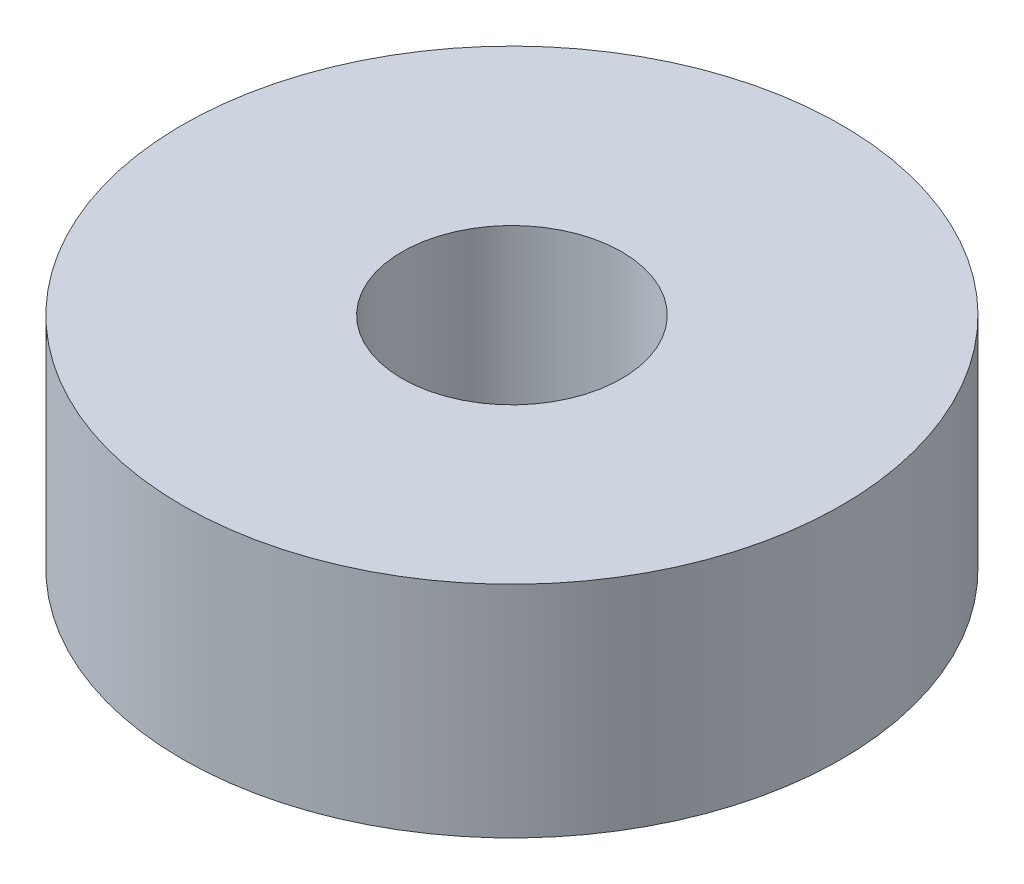
ISO-10303-21;
HEADER;
FILE_DESCRIPTION(('STEP AP214'),'2;1');
FILE_NAME('part.step','',(''),(''),'','','');
FILE_SCHEMA(('AUTOMOTIVE_DESIGN { 1 0 10303 214 1 1 1 1 }'));
ENDSEC;
DATA;
#1=APPLICATION_CONTEXT('core data for automotive mechanical design processes');
#2=APPLICATION_PROTOCOL_DEFINITION('international standard','automotive_design',2000,#1);
#3=PRODUCT_CONTEXT('',#1,'mechanical');
#4=PRODUCT('Part','Part','',(#3));
#5=PRODUCT_RELATED_PRODUCT_CATEGORY('part','',(#4));
#6=PRODUCT_DEFINITION_FORMATION('','',#4);
#7=PRODUCT_DEFINITION_CONTEXT('part definition',#1,'design');
#8=PRODUCT_DEFINITION('design','',#6,#7);
#9=PRODUCT_DEFINITION_SHAPE('','',#8);
#10=(LENGTH_UNIT() NAMED_UNIT(*) SI_UNIT(.MILLI.,.METRE.));
#11=(NAMED_UNIT(*) PLANE_ANGLE_UNIT() SI_UNIT($,.RADIAN.));
#12=(NAMED_UNIT(*) SI_UNIT($,.STERADIAN.) SOLID_ANGLE_UNIT());
#13=UNCERTAINTY_MEASURE_WITH_UNIT(LENGTH_MEASURE(1.E-05),#10,'distance_accuracy_value','');
#14=(GEOMETRIC_REPRESENTATION_CONTEXT(3) GLOBAL_UNCERTAINTY_ASSIGNED_CONTEXT((#13)) GLOBAL_UNIT_ASSIGNED_CONTEXT((#10,
#11,#12)) REPRESENTATION_CONTEXT('',''));
#15=CARTESIAN_POINT('',(0.,0.,0.));
#16=DIRECTION('',(0.,0.,1.));
#17=DIRECTION('',(1.,0.,0.));
#18=AXIS2_PLACEMENT_3D('',#15,#16,#17);
#19=CARTESIAN_POINT('',(0.,10.,0.));
#20=DIRECTION('',(0.,1.,0.));
#21=DIRECTION('',(0.,0.,1.));
#22=AXIS2_PLACEMENT_3D('',#19,#20,#21);
#23=PLANE('',#22);
#24=CARTESIAN_POINT('',(0.,10.,0.));
#25=DIRECTION('',(0.,1.,0.));
#26=DIRECTION('',(0.,0.,1.));
#27=AXIS2_PLACEMENT_3D('',#24,#25,#26);
#28=CIRCLE('',#27,15.);
#29=CARTESIAN_POINT('',(0.,10.,15.));
#30=VERTEX_POINT('',#29);
#31=EDGE_CURVE('E10',#30,#30,#28,.T.);
#32=ORIENTED_EDGE('',*,*,#31,.T.);
#33=EDGE_LOOP('',(#32));
#34=FACE_BOUND('',#33,.T.);
#35=CARTESIAN_POINT('',(0.,10.,0.));
#36=DIRECTION('',(0.,1.,0.));
#37=DIRECTION('',(0.,0.,1.));
#38=AXIS2_PLACEMENT_3D('',#35,#36,#37);
#39=CIRCLE('',#38,5.);
#40=CARTESIAN_POINT('',(0.,10.,5.));
#41=VERTEX_POINT('',#40);
#42=EDGE_CURVE('E56',#41,#41,#39,.T.);
#43=ORIENTED_EDGE('',*,*,#42,.F.);
#44=EDGE_LOOP('',(#43));
#45=FACE_BOUND('',#44,.T.);
#46=ADVANCED_FACE('F43',(#34,#45),#23,.T.);
#47=CARTESIAN_POINT('',(0.,0.,0.));
#48=DIRECTION('',(0.,1.,0.));
#49=DIRECTION('',(0.,0.,1.));
#50=AXIS2_PLACEMENT_3D('',#47,#48,#49);
#51=PLANE('',#50);
#52=CARTESIAN_POINT('',(0.,0.,0.));
#53=DIRECTION('',(0.,1.,0.));
#54=DIRECTION('',(0.,0.,1.));
#55=AXIS2_PLACEMENT_3D('',#52,#53,#54);
#56=CIRCLE('',#55,15.);
#57=CARTESIAN_POINT('',(0.,0.,15.));
#58=VERTEX_POINT('',#57);
#59=EDGE_CURVE('E47',#58,#58,#56,.T.);
#60=ORIENTED_EDGE('',*,*,#59,.F.);
#61=EDGE_LOOP('',(#60));
#62=FACE_BOUND('',#61,.T.);
#63=CARTESIAN_POINT('',(0.,0.,0.));
#64=DIRECTION('',(0.,1.,0.));
#65=DIRECTION('',(0.,0.,1.));
#66=AXIS2_PLACEMENT_3D('',#63,#64,#65);
#67=CIRCLE('',#66,5.);
#68=CARTESIAN_POINT('',(0.,0.,5.));
#69=VERTEX_POINT('',#68);
#70=EDGE_CURVE('E58',#69,#69,#67,.T.);
#71=ORIENTED_EDGE('',*,*,#70,.T.);
#72=EDGE_LOOP('',(#71));
#73=FACE_BOUND('',#72,.T.);
#74=ADVANCED_FACE('F70',(#62,#73),#51,.F.);
#75=CARTESIAN_POINT('',(0.,10.,0.));
#76=DIRECTION('',(0.,-1.,0.));
#77=DIRECTION('',(0.,0.,-1.));
#78=AXIS2_PLACEMENT_3D('',#75,#76,#77);
#79=CYLINDRICAL_SURFACE('',#78,15.);
#80=ORIENTED_EDGE('',*,*,#31,.F.);
#81=EDGE_LOOP('',(#80));
#82=FACE_BOUND('',#81,.T.);
#83=ORIENTED_EDGE('',*,*,#59,.T.);
#84=EDGE_LOOP('',(#83));
#85=FACE_BOUND('',#84,.T.);
#86=ADVANCED_FACE('F45',(#82,#85),#79,.T.);
#87=CARTESIAN_POINT('',(0.,10.,0.));
#88=DIRECTION('',(0.,-1.,0.));
#89=DIRECTION('',(0.,0.,-1.));
#90=AXIS2_PLACEMENT_3D('',#87,#88,#89);
#91=CYLINDRICAL_SURFACE('',#90,5.);
#92=ORIENTED_EDGE('',*,*,#42,.T.);
#93=EDGE_LOOP('',(#92));
#94=FACE_BOUND('',#93,.T.);
#95=ORIENTED_EDGE('',*,*,#70,.F.);
#96=EDGE_LOOP('',(#95));
#97=FACE_BOUND('',#96,.T.);
#98=ADVANCED_FACE('F66',(#94,#97),#91,.F.);
#99=CLOSED_SHELL('',(#46,#74,#86,#98));
#100=MANIFOLD_SOLID_BREP('B2',#99);
#101=ADVANCED_BREP_SHAPE_REPRESENTATION('',(#18,#100),#14);
#102=SHAPE_DEFINITION_REPRESENTATION(#9,#101);
ENDSEC;
END-ISO-10303-21;
